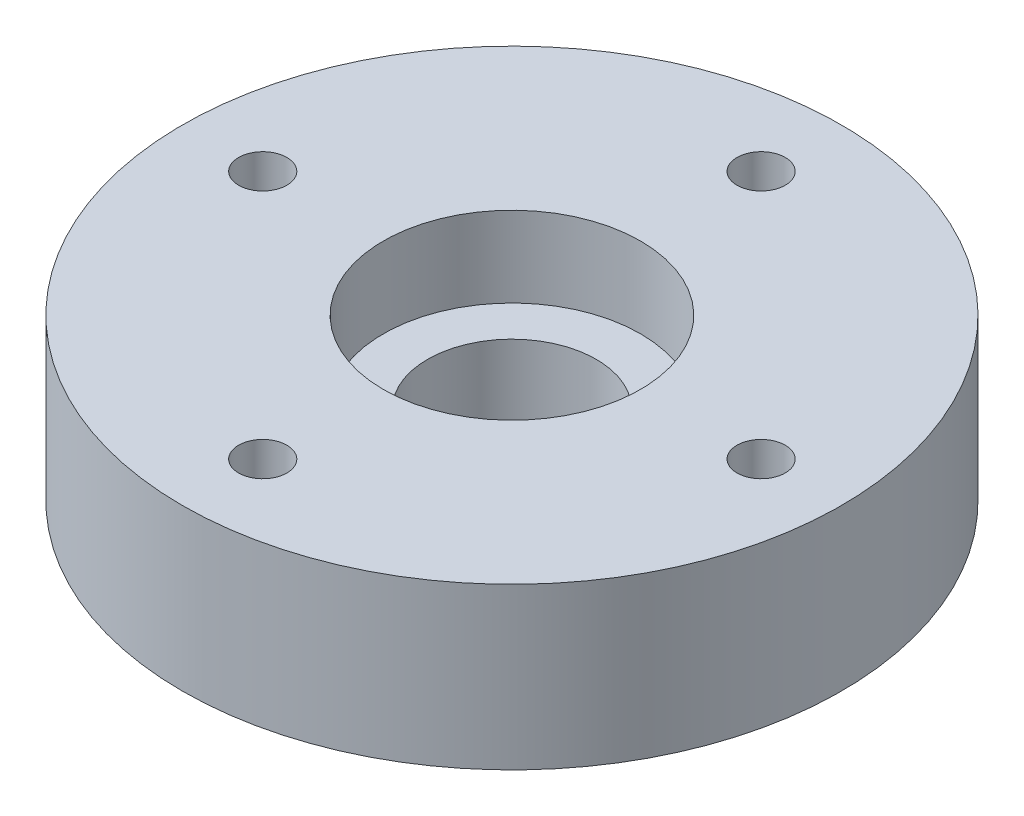
ISO-10303-21;
HEADER;
FILE_DESCRIPTION(('STEP AP214'),'2;1');
FILE_NAME('part.step','',(''),(''),'','','');
FILE_SCHEMA(('AUTOMOTIVE_DESIGN { 1 0 10303 214 1 1 1 1 }'));
ENDSEC;
DATA;
#1=APPLICATION_CONTEXT('core data for automotive mechanical design processes');
#2=APPLICATION_PROTOCOL_DEFINITION('international standard','automotive_design',2000,#1);
#3=PRODUCT_CONTEXT('',#1,'mechanical');
#4=PRODUCT('Part','Part','',(#3));
#5=PRODUCT_RELATED_PRODUCT_CATEGORY('part','',(#4));
#6=PRODUCT_DEFINITION_FORMATION('','',#4);
#7=PRODUCT_DEFINITION_CONTEXT('part definition',#1,'design');
#8=PRODUCT_DEFINITION('design','',#6,#7);
#9=PRODUCT_DEFINITION_SHAPE('','',#8);
#10=(LENGTH_UNIT() NAMED_UNIT(*) SI_UNIT(.MILLI.,.METRE.));
#11=(NAMED_UNIT(*) PLANE_ANGLE_UNIT() SI_UNIT($,.RADIAN.));
#12=(NAMED_UNIT(*) SI_UNIT($,.STERADIAN.) SOLID_ANGLE_UNIT());
#13=UNCERTAINTY_MEASURE_WITH_UNIT(LENGTH_MEASURE(1.E-05),#10,'distance_accuracy_value','');
#14=(GEOMETRIC_REPRESENTATION_CONTEXT(3) GLOBAL_UNCERTAINTY_ASSIGNED_CONTEXT((#13)) GLOBAL_UNIT_ASSIGNED_CONTEXT((#10,
#11,#12)) REPRESENTATION_CONTEXT('',''));
#15=CARTESIAN_POINT('',(0.,0.,0.));
#16=DIRECTION('',(0.,0.,1.));
#17=DIRECTION('',(1.,0.,0.));
#18=AXIS2_PLACEMENT_3D('',#15,#16,#17);
#19=CARTESIAN_POINT('',(0.,10.,0.));
#20=DIRECTION('',(0.,-1.,0.));
#21=DIRECTION('',(0.,0.,-1.));
#22=AXIS2_PLACEMENT_3D('',#19,#20,#21);
#23=CYLINDRICAL_SURFACE('',#22,5.25);
#24=CARTESIAN_POINT('',(0.,0.,0.));
#25=DIRECTION('',(0.,1.,0.));
#26=DIRECTION('',(0.,0.,1.));
#27=AXIS2_PLACEMENT_3D('',#24,#25,#26);
#28=CIRCLE('',#27,5.25);
#29=CARTESIAN_POINT('',(0.,0.,5.25));
#30=VERTEX_POINT('',#29);
#31=EDGE_CURVE('E45',#30,#30,#28,.T.);
#32=ORIENTED_EDGE('',*,*,#31,.F.);
#33=EDGE_LOOP('',(#32));
#34=FACE_BOUND('',#33,.T.);
#35=CARTESIAN_POINT('',(0.,5.,0.));
#36=DIRECTION('',(0.,1.,0.));
#37=DIRECTION('',(0.,0.,1.));
#38=AXIS2_PLACEMENT_3D('',#35,#36,#37);
#39=CIRCLE('',#38,5.25);
#40=CARTESIAN_POINT('',(0.,5.,5.25));
#41=VERTEX_POINT('',#40);
#42=EDGE_CURVE('E36',#41,#41,#39,.T.);
#43=ORIENTED_EDGE('',*,*,#42,.T.);
#44=EDGE_LOOP('',(#43));
#45=FACE_BOUND('',#44,.T.);
#46=ADVANCED_FACE('F32',(#34,#45),#23,.F.);
#47=CARTESIAN_POINT('',(0.,10.,0.));
#48=DIRECTION('',(0.,1.,0.));
#49=DIRECTION('',(0.,0.,1.));
#50=AXIS2_PLACEMENT_3D('',#47,#48,#49);
#51=PLANE('',#50);
#52=CARTESIAN_POINT('',(0.,10.,-15.5));
#53=DIRECTION('',(0.,1.,0.));
#54=DIRECTION('',(0.,0.,1.));
#55=AXIS2_PLACEMENT_3D('',#52,#53,#54);
#56=CIRCLE('',#55,1.5);
#57=CARTESIAN_POINT('',(0.,10.,-14.));
#58=VERTEX_POINT('',#57);
#59=EDGE_CURVE('E74',#58,#58,#56,.T.);
#60=ORIENTED_EDGE('',*,*,#59,.F.);
#61=EDGE_LOOP('',(#60));
#62=FACE_BOUND('',#61,.T.);
#63=CARTESIAN_POINT('',(15.5,10.,0.));
#64=DIRECTION('',(0.,1.,0.));
#65=DIRECTION('',(0.,0.,1.));
#66=AXIS2_PLACEMENT_3D('',#63,#64,#65);
#67=CIRCLE('',#66,1.5);
#68=CARTESIAN_POINT('',(15.5,10.,1.5));
#69=VERTEX_POINT('',#68);
#70=EDGE_CURVE('E68',#69,#69,#67,.T.);
#71=ORIENTED_EDGE('',*,*,#70,.F.);
#72=EDGE_LOOP('',(#71));
#73=FACE_BOUND('',#72,.T.);
#74=CARTESIAN_POINT('',(0.,10.,15.5));
#75=DIRECTION('',(0.,1.,0.));
#76=DIRECTION('',(0.,0.,1.));
#77=AXIS2_PLACEMENT_3D('',#74,#75,#76);
#78=CIRCLE('',#77,1.5);
#79=CARTESIAN_POINT('',(0.,10.,17.));
#80=VERTEX_POINT('',#79);
#81=EDGE_CURVE('E62',#80,#80,#78,.T.);
#82=ORIENTED_EDGE('',*,*,#81,.F.);
#83=EDGE_LOOP('',(#82));
#84=FACE_BOUND('',#83,.T.);
#85=CARTESIAN_POINT('',(-15.5,10.,0.));
#86=DIRECTION('',(0.,1.,0.));
#87=DIRECTION('',(0.,0.,1.));
#88=AXIS2_PLACEMENT_3D('',#85,#86,#87);
#89=CIRCLE('',#88,1.5);
#90=CARTESIAN_POINT('',(-15.5,10.,1.5));
#91=VERTEX_POINT('',#90);
#92=EDGE_CURVE('E56',#91,#91,#89,.T.);
#93=ORIENTED_EDGE('',*,*,#92,.F.);
#94=EDGE_LOOP('',(#93));
#95=FACE_BOUND('',#94,.T.);
#96=CARTESIAN_POINT('',(0.,10.,0.));
#97=DIRECTION('',(0.,1.,0.));
#98=DIRECTION('',(0.,0.,1.));
#99=AXIS2_PLACEMENT_3D('',#96,#97,#98);
#100=CIRCLE('',#99,8.);
#101=CARTESIAN_POINT('',(0.,10.,8.));
#102=VERTEX_POINT('',#101);
#103=EDGE_CURVE('E49',#102,#102,#100,.T.);
#104=ORIENTED_EDGE('',*,*,#103,.F.);
#105=EDGE_LOOP('',(#104));
#106=FACE_BOUND('',#105,.T.);
#107=CARTESIAN_POINT('',(0.,10.,0.));
#108=DIRECTION('',(0.,1.,0.));
#109=DIRECTION('',(0.,0.,1.));
#110=AXIS2_PLACEMENT_3D('',#107,#108,#109);
#111=CIRCLE('',#110,20.5);
#112=CARTESIAN_POINT('',(0.,10.,20.5));
#113=VERTEX_POINT('',#112);
#114=EDGE_CURVE('E10',#113,#113,#111,.T.);
#115=ORIENTED_EDGE('',*,*,#114,.T.);
#116=EDGE_LOOP('',(#115));
#117=FACE_BOUND('',#116,.T.);
#118=ADVANCED_FACE('F90',(#62,#73,#84,#95,#106,#117),#51,.T.);
#119=CARTESIAN_POINT('',(0.,0.,0.));
#120=DIRECTION('',(0.,1.,0.));
#121=DIRECTION('',(0.,0.,1.));
#122=AXIS2_PLACEMENT_3D('',#119,#120,#121);
#123=PLANE('',#122);
#124=CARTESIAN_POINT('',(0.,0.,-15.5));
#125=DIRECTION('',(0.,1.,0.));
#126=DIRECTION('',(0.,0.,1.));
#127=AXIS2_PLACEMENT_3D('',#124,#125,#126);
#128=CIRCLE('',#127,1.5);
#129=CARTESIAN_POINT('',(0.,0.,-14.));
#130=VERTEX_POINT('',#129);
#131=EDGE_CURVE('E53',#130,#130,#128,.T.);
#132=ORIENTED_EDGE('',*,*,#131,.T.);
#133=EDGE_LOOP('',(#132));
#134=FACE_BOUND('',#133,.T.);
#135=CARTESIAN_POINT('',(15.5,0.,0.));
#136=DIRECTION('',(0.,1.,0.));
#137=DIRECTION('',(0.,0.,1.));
#138=AXIS2_PLACEMENT_3D('',#135,#136,#137);
#139=CIRCLE('',#138,1.5);
#140=CARTESIAN_POINT('',(15.5,0.,1.5));
#141=VERTEX_POINT('',#140);
#142=EDGE_CURVE('E71',#141,#141,#139,.T.);
#143=ORIENTED_EDGE('',*,*,#142,.T.);
#144=EDGE_LOOP('',(#143));
#145=FACE_BOUND('',#144,.T.);
#146=CARTESIAN_POINT('',(0.,0.,15.5));
#147=DIRECTION('',(0.,1.,0.));
#148=DIRECTION('',(0.,0.,1.));
#149=AXIS2_PLACEMENT_3D('',#146,#147,#148);
#150=CIRCLE('',#149,1.5);
#151=CARTESIAN_POINT('',(0.,0.,17.));
#152=VERTEX_POINT('',#151);
#153=EDGE_CURVE('E65',#152,#152,#150,.T.);
#154=ORIENTED_EDGE('',*,*,#153,.T.);
#155=EDGE_LOOP('',(#154));
#156=FACE_BOUND('',#155,.T.);
#157=CARTESIAN_POINT('',(-15.5,0.,0.));
#158=DIRECTION('',(0.,1.,0.));
#159=DIRECTION('',(0.,0.,1.));
#160=AXIS2_PLACEMENT_3D('',#157,#158,#159);
#161=CIRCLE('',#160,1.5);
#162=CARTESIAN_POINT('',(-15.5,0.,1.5));
#163=VERTEX_POINT('',#162);
#164=EDGE_CURVE('E59',#163,#163,#161,.T.);
#165=ORIENTED_EDGE('',*,*,#164,.T.);
#166=EDGE_LOOP('',(#165));
#167=FACE_BOUND('',#166,.T.);
#168=CARTESIAN_POINT('',(0.,0.,0.));
#169=DIRECTION('',(0.,1.,0.));
#170=DIRECTION('',(0.,0.,1.));
#171=AXIS2_PLACEMENT_3D('',#168,#169,#170);
#172=CIRCLE('',#171,20.5);
#173=CARTESIAN_POINT('',(0.,0.,20.5));
#174=VERTEX_POINT('',#173);
#175=EDGE_CURVE('E40',#174,#174,#172,.T.);
#176=ORIENTED_EDGE('',*,*,#175,.F.);
#177=EDGE_LOOP('',(#176));
#178=FACE_BOUND('',#177,.T.);
#179=ORIENTED_EDGE('',*,*,#31,.T.);
#180=EDGE_LOOP('',(#179));
#181=FACE_BOUND('',#180,.T.);
#182=ADVANCED_FACE('F80',(#134,#145,#156,#167,#178,#181),#123,.F.);
#183=CARTESIAN_POINT('',(0.,10.,0.));
#184=DIRECTION('',(0.,-1.,0.));
#185=DIRECTION('',(0.,0.,-1.));
#186=AXIS2_PLACEMENT_3D('',#183,#184,#185);
#187=CYLINDRICAL_SURFACE('',#186,20.5);
#188=ORIENTED_EDGE('',*,*,#114,.F.);
#189=EDGE_LOOP('',(#188));
#190=FACE_BOUND('',#189,.T.);
#191=ORIENTED_EDGE('',*,*,#175,.T.);
#192=EDGE_LOOP('',(#191));
#193=FACE_BOUND('',#192,.T.);
#194=ADVANCED_FACE('F34',(#190,#193),#187,.T.);
#195=CARTESIAN_POINT('',(0.,5.,0.));
#196=DIRECTION('',(0.,1.,0.));
#197=DIRECTION('',(0.,0.,1.));
#198=AXIS2_PLACEMENT_3D('',#195,#196,#197);
#199=CYLINDRICAL_SURFACE('',#198,8.);
#200=CARTESIAN_POINT('',(0.,5.,0.));
#201=DIRECTION('',(0.,1.,0.));
#202=DIRECTION('',(0.,0.,1.));
#203=AXIS2_PLACEMENT_3D('',#200,#201,#202);
#204=CIRCLE('',#203,8.);
#205=CARTESIAN_POINT('',(0.,5.,8.));
#206=VERTEX_POINT('',#205);
#207=EDGE_CURVE('E52',#206,#206,#204,.T.);
#208=ORIENTED_EDGE('',*,*,#207,.F.);
#209=EDGE_LOOP('',(#208));
#210=FACE_BOUND('',#209,.T.);
#211=ORIENTED_EDGE('',*,*,#103,.T.);
#212=EDGE_LOOP('',(#211));
#213=FACE_BOUND('',#212,.T.);
#214=ADVANCED_FACE('F102',(#210,#213),#199,.F.);
#215=CARTESIAN_POINT('',(0.,5.,0.));
#216=DIRECTION('',(0.,1.,0.));
#217=DIRECTION('',(0.,0.,1.));
#218=AXIS2_PLACEMENT_3D('',#215,#216,#217);
#219=PLANE('',#218);
#220=ORIENTED_EDGE('',*,*,#42,.F.);
#221=EDGE_LOOP('',(#220));
#222=FACE_BOUND('',#221,.T.);
#223=ORIENTED_EDGE('',*,*,#207,.T.);
#224=EDGE_LOOP('',(#223));
#225=FACE_BOUND('',#224,.T.);
#226=ADVANCED_FACE('F104',(#222,#225),#219,.T.);
#227=CARTESIAN_POINT('',(-15.5,0.,0.));
#228=DIRECTION('',(0.,1.,0.));
#229=DIRECTION('',(0.,0.,1.));
#230=AXIS2_PLACEMENT_3D('',#227,#228,#229);
#231=CYLINDRICAL_SURFACE('',#230,1.5);
#232=ORIENTED_EDGE('',*,*,#164,.F.);
#233=EDGE_LOOP('',(#232));
#234=FACE_BOUND('',#233,.T.);
#235=ORIENTED_EDGE('',*,*,#92,.T.);
#236=EDGE_LOOP('',(#235));
#237=FACE_BOUND('',#236,.T.);
#238=ADVANCED_FACE('F111',(#234,#237),#231,.F.);
#239=CARTESIAN_POINT('',(0.,0.,15.5));
#240=DIRECTION('',(0.,1.,0.));
#241=DIRECTION('',(0.,0.,1.));
#242=AXIS2_PLACEMENT_3D('',#239,#240,#241);
#243=CYLINDRICAL_SURFACE('',#242,1.5);
#244=ORIENTED_EDGE('',*,*,#153,.F.);
#245=EDGE_LOOP('',(#244));
#246=FACE_BOUND('',#245,.T.);
#247=ORIENTED_EDGE('',*,*,#81,.T.);
#248=EDGE_LOOP('',(#247));
#249=FACE_BOUND('',#248,.T.);
#250=ADVANCED_FACE('F161',(#246,#249),#243,.F.);
#251=CARTESIAN_POINT('',(15.5,0.,0.));
#252=DIRECTION('',(0.,1.,0.));
#253=DIRECTION('',(0.,0.,1.));
#254=AXIS2_PLACEMENT_3D('',#251,#252,#253);
#255=CYLINDRICAL_SURFACE('',#254,1.5);
#256=ORIENTED_EDGE('',*,*,#142,.F.);
#257=EDGE_LOOP('',(#256));
#258=FACE_BOUND('',#257,.T.);
#259=ORIENTED_EDGE('',*,*,#70,.T.);
#260=EDGE_LOOP('',(#259));
#261=FACE_BOUND('',#260,.T.);
#262=ADVANCED_FACE('F86',(#258,#261),#255,.F.);
#263=CARTESIAN_POINT('',(0.,0.,-15.5));
#264=DIRECTION('',(0.,1.,0.));
#265=DIRECTION('',(0.,0.,1.));
#266=AXIS2_PLACEMENT_3D('',#263,#264,#265);
#267=CYLINDRICAL_SURFACE('',#266,1.5);
#268=ORIENTED_EDGE('',*,*,#131,.F.);
#269=EDGE_LOOP('',(#268));
#270=FACE_BOUND('',#269,.T.);
#271=ORIENTED_EDGE('',*,*,#59,.T.);
#272=EDGE_LOOP('',(#271));
#273=FACE_BOUND('',#272,.T.);
#274=ADVANCED_FACE('F83',(#270,#273),#267,.F.);
#275=CLOSED_SHELL('',(#46,#118,#182,#194,#214,#226,#238,#250,#262,#274));
#276=MANIFOLD_SOLID_BREP('B2',#275);
#277=ADVANCED_BREP_SHAPE_REPRESENTATION('',(#18,#276),#14);
#278=SHAPE_DEFINITION_REPRESENTATION(#9,#277);
ENDSEC;
END-ISO-10303-21;
